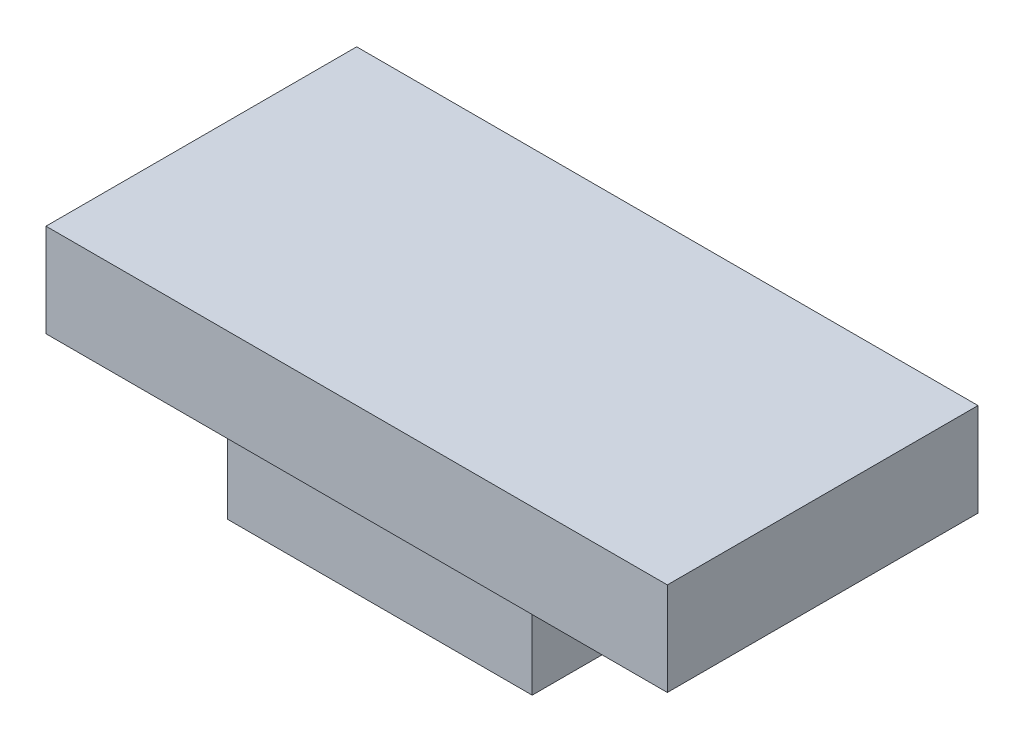
ISO-10303-21;
HEADER;
FILE_DESCRIPTION(('STEP AP214'),'2;1');
FILE_NAME('part.step','',(''),(''),'','','');
FILE_SCHEMA(('AUTOMOTIVE_DESIGN { 1 0 10303 214 1 1 1 1 }'));
ENDSEC;
DATA;
#1=APPLICATION_CONTEXT('core data for automotive mechanical design processes');
#2=APPLICATION_PROTOCOL_DEFINITION('international standard','automotive_design',2000,#1);
#3=PRODUCT_CONTEXT('',#1,'mechanical');
#4=PRODUCT('Part','Part','',(#3));
#5=PRODUCT_RELATED_PRODUCT_CATEGORY('part','',(#4));
#6=PRODUCT_DEFINITION_FORMATION('','',#4);
#7=PRODUCT_DEFINITION_CONTEXT('part definition',#1,'design');
#8=PRODUCT_DEFINITION('design','',#6,#7);
#9=PRODUCT_DEFINITION_SHAPE('','',#8);
#10=(LENGTH_UNIT() NAMED_UNIT(*) SI_UNIT(.MILLI.,.METRE.));
#11=(NAMED_UNIT(*) PLANE_ANGLE_UNIT() SI_UNIT($,.RADIAN.));
#12=(NAMED_UNIT(*) SI_UNIT($,.STERADIAN.) SOLID_ANGLE_UNIT());
#13=UNCERTAINTY_MEASURE_WITH_UNIT(LENGTH_MEASURE(1.E-05),#10,'distance_accuracy_value','');
#14=(GEOMETRIC_REPRESENTATION_CONTEXT(3) GLOBAL_UNCERTAINTY_ASSIGNED_CONTEXT((#13)) GLOBAL_UNIT_ASSIGNED_CONTEXT((#10,
#11,#12)) REPRESENTATION_CONTEXT('',''));
#15=CARTESIAN_POINT('',(0.,0.,0.));
#16=DIRECTION('',(0.,0.,1.));
#17=DIRECTION('',(1.,0.,0.));
#18=AXIS2_PLACEMENT_3D('',#15,#16,#17);
#19=CARTESIAN_POINT('',(0.,0.,0.));
#20=DIRECTION('',(0.,-1.,0.));
#21=DIRECTION('',(0.,0.,-1.));
#22=AXIS2_PLACEMENT_3D('',#19,#20,#21);
#23=PLANE('',#22);
#24=DIRECTION('',(0.,0.,-1.));
#25=VECTOR('',#24,1.);
#26=CARTESIAN_POINT('',(10.,0.,5.));
#27=LINE('',#26,#25);
#28=CARTESIAN_POINT('',(10.,0.,5.));
#29=VERTEX_POINT('',#28);
#30=CARTESIAN_POINT('',(10.,0.,-5.));
#31=VERTEX_POINT('',#30);
#32=EDGE_CURVE('E224',#29,#31,#27,.T.);
#33=ORIENTED_EDGE('',*,*,#32,.F.);
#34=DIRECTION('',(1.,0.,0.));
#35=VECTOR('',#34,1.);
#36=CARTESIAN_POINT('',(-10.,0.,5.));
#37=LINE('',#36,#35);
#38=CARTESIAN_POINT('',(-10.,0.,5.));
#39=VERTEX_POINT('',#38);
#40=EDGE_CURVE('E230',#39,#29,#37,.T.);
#41=ORIENTED_EDGE('',*,*,#40,.F.);
#42=DIRECTION('',(0.,0.,1.));
#43=VECTOR('',#42,1.);
#44=CARTESIAN_POINT('',(-10.,0.,5.));
#45=LINE('',#44,#43);
#46=CARTESIAN_POINT('',(-10.,0.,-5.));
#47=VERTEX_POINT('',#46);
#48=EDGE_CURVE('E246',#47,#39,#45,.T.);
#49=ORIENTED_EDGE('',*,*,#48,.F.);
#50=DIRECTION('',(-1.,0.,0.));
#51=VECTOR('',#50,1.);
#52=CARTESIAN_POINT('',(-10.,0.,-5.));
#53=LINE('',#52,#51);
#54=EDGE_CURVE('E243',#31,#47,#53,.T.);
#55=ORIENTED_EDGE('',*,*,#54,.F.);
#56=EDGE_LOOP('',(#33,#41,#49,#55));
#57=FACE_BOUND('',#56,.T.);
#58=DIRECTION('',(-1.,0.,0.));
#59=VECTOR('',#58,1.);
#60=CARTESIAN_POINT('',(-4.9,0.,4.25));
#61=LINE('',#60,#59);
#62=CARTESIAN_POINT('',(4.9,0.,4.25));
#63=VERTEX_POINT('',#62);
#64=CARTESIAN_POINT('',(-4.9,0.,4.25));
#65=VERTEX_POINT('',#64);
#66=EDGE_CURVE('E204',#63,#65,#61,.T.);
#67=ORIENTED_EDGE('',*,*,#66,.F.);
#68=DIRECTION('',(0.,0.,1.));
#69=VECTOR('',#68,1.);
#70=CARTESIAN_POINT('',(4.9,0.,-4.25));
#71=LINE('',#70,#69);
#72=CARTESIAN_POINT('',(4.9,0.,-4.25));
#73=VERTEX_POINT('',#72);
#74=EDGE_CURVE('E154',#73,#63,#71,.T.);
#75=ORIENTED_EDGE('',*,*,#74,.F.);
#76=DIRECTION('',(1.,0.,0.));
#77=VECTOR('',#76,1.);
#78=CARTESIAN_POINT('',(-4.9,0.,-4.25));
#79=LINE('',#78,#77);
#80=CARTESIAN_POINT('',(-4.9,0.,-4.25));
#81=VERTEX_POINT('',#80);
#82=EDGE_CURVE('E191',#81,#73,#79,.T.);
#83=ORIENTED_EDGE('',*,*,#82,.F.);
#84=DIRECTION('',(0.,0.,-1.));
#85=VECTOR('',#84,1.);
#86=CARTESIAN_POINT('',(-4.9,0.,-4.25));
#87=LINE('',#86,#85);
#88=EDGE_CURVE('E207',#65,#81,#87,.T.);
#89=ORIENTED_EDGE('',*,*,#88,.F.);
#90=EDGE_LOOP('',(#67,#75,#83,#89));
#91=FACE_BOUND('',#90,.T.);
#92=ADVANCED_FACE('F43',(#57,#91),#23,.T.);
#93=CARTESIAN_POINT('',(10.,3.,5.));
#94=DIRECTION('',(-1.,0.,0.));
#95=DIRECTION('',(0.,0.,1.));
#96=AXIS2_PLACEMENT_3D('',#93,#94,#95);
#97=PLANE('',#96);
#98=ORIENTED_EDGE('',*,*,#32,.T.);
#99=DIRECTION('',(0.,-1.,0.));
#100=VECTOR('',#99,1.);
#101=CARTESIAN_POINT('',(10.,3.,-5.));
#102=LINE('',#101,#100);
#103=CARTESIAN_POINT('',(10.,3.,-5.));
#104=VERTEX_POINT('',#103);
#105=EDGE_CURVE('E11',#104,#31,#102,.T.);
#106=ORIENTED_EDGE('',*,*,#105,.F.);
#107=DIRECTION('',(0.,0.,-1.));
#108=VECTOR('',#107,1.);
#109=CARTESIAN_POINT('',(10.,3.,5.));
#110=LINE('',#109,#108);
#111=CARTESIAN_POINT('',(10.,3.,5.));
#112=VERTEX_POINT('',#111);
#113=EDGE_CURVE('E225',#112,#104,#110,.T.);
#114=ORIENTED_EDGE('',*,*,#113,.F.);
#115=DIRECTION('',(0.,-1.,0.));
#116=VECTOR('',#115,1.);
#117=CARTESIAN_POINT('',(10.,3.,5.));
#118=LINE('',#117,#116);
#119=EDGE_CURVE('E239',#112,#29,#118,.T.);
#120=ORIENTED_EDGE('',*,*,#119,.T.);
#121=EDGE_LOOP('',(#98,#106,#114,#120));
#122=FACE_BOUND('',#121,.T.);
#123=ADVANCED_FACE('F45',(#122),#97,.F.);
#124=CARTESIAN_POINT('',(-10.,3.,-5.));
#125=DIRECTION('',(0.,0.,1.));
#126=DIRECTION('',(1.,0.,0.));
#127=AXIS2_PLACEMENT_3D('',#124,#125,#126);
#128=PLANE('',#127);
#129=ORIENTED_EDGE('',*,*,#54,.T.);
#130=DIRECTION('',(0.,-1.,0.));
#131=VECTOR('',#130,1.);
#132=CARTESIAN_POINT('',(-10.,3.,-5.));
#133=LINE('',#132,#131);
#134=CARTESIAN_POINT('',(-10.,3.,-5.));
#135=VERTEX_POINT('',#134);
#136=EDGE_CURVE('E52',#135,#47,#133,.T.);
#137=ORIENTED_EDGE('',*,*,#136,.F.);
#138=DIRECTION('',(-1.,0.,0.));
#139=VECTOR('',#138,1.);
#140=CARTESIAN_POINT('',(-10.,3.,-5.));
#141=LINE('',#140,#139);
#142=EDGE_CURVE('E229',#104,#135,#141,.T.);
#143=ORIENTED_EDGE('',*,*,#142,.F.);
#144=ORIENTED_EDGE('',*,*,#105,.T.);
#145=EDGE_LOOP('',(#129,#137,#143,#144));
#146=FACE_BOUND('',#145,.T.);
#147=ADVANCED_FACE('F279',(#146),#128,.F.);
#148=CARTESIAN_POINT('',(-10.,3.,5.));
#149=DIRECTION('',(1.,0.,0.));
#150=DIRECTION('',(0.,0.,-1.));
#151=AXIS2_PLACEMENT_3D('',#148,#149,#150);
#152=PLANE('',#151);
#153=ORIENTED_EDGE('',*,*,#48,.T.);
#154=DIRECTION('',(0.,-1.,0.));
#155=VECTOR('',#154,1.);
#156=CARTESIAN_POINT('',(-10.,3.,5.));
#157=LINE('',#156,#155);
#158=CARTESIAN_POINT('',(-10.,3.,5.));
#159=VERTEX_POINT('',#158);
#160=EDGE_CURVE('E254',#159,#39,#157,.T.);
#161=ORIENTED_EDGE('',*,*,#160,.F.);
#162=DIRECTION('',(0.,0.,1.));
#163=VECTOR('',#162,1.);
#164=CARTESIAN_POINT('',(-10.,3.,5.));
#165=LINE('',#164,#163);
#166=EDGE_CURVE('E233',#135,#159,#165,.T.);
#167=ORIENTED_EDGE('',*,*,#166,.F.);
#168=ORIENTED_EDGE('',*,*,#136,.T.);
#169=EDGE_LOOP('',(#153,#161,#167,#168));
#170=FACE_BOUND('',#169,.T.);
#171=ADVANCED_FACE('F263',(#170),#152,.F.);
#172=CARTESIAN_POINT('',(-10.,3.,5.));
#173=DIRECTION('',(0.,0.,-1.));
#174=DIRECTION('',(-1.,0.,0.));
#175=AXIS2_PLACEMENT_3D('',#172,#173,#174);
#176=PLANE('',#175);
#177=ORIENTED_EDGE('',*,*,#40,.T.);
#178=ORIENTED_EDGE('',*,*,#119,.F.);
#179=DIRECTION('',(1.,0.,0.));
#180=VECTOR('',#179,1.);
#181=CARTESIAN_POINT('',(-10.,3.,5.));
#182=LINE('',#181,#180);
#183=EDGE_CURVE('E236',#159,#112,#182,.T.);
#184=ORIENTED_EDGE('',*,*,#183,.F.);
#185=ORIENTED_EDGE('',*,*,#160,.T.);
#186=EDGE_LOOP('',(#177,#178,#184,#185));
#187=FACE_BOUND('',#186,.T.);
#188=ADVANCED_FACE('F272',(#187),#176,.F.);
#189=CARTESIAN_POINT('',(0.,3.,0.));
#190=DIRECTION('',(0.,-1.,0.));
#191=DIRECTION('',(0.,0.,-1.));
#192=AXIS2_PLACEMENT_3D('',#189,#190,#191);
#193=PLANE('',#192);
#194=ORIENTED_EDGE('',*,*,#113,.T.);
#195=ORIENTED_EDGE('',*,*,#142,.T.);
#196=ORIENTED_EDGE('',*,*,#166,.T.);
#197=ORIENTED_EDGE('',*,*,#183,.T.);
#198=EDGE_LOOP('',(#194,#195,#196,#197));
#199=FACE_BOUND('',#198,.T.);
#200=ADVANCED_FACE('F278',(#199),#193,.F.);
#201=CARTESIAN_POINT('',(0.,-3.,0.));
#202=DIRECTION('',(0.,1.,0.));
#203=DIRECTION('',(0.,0.,1.));
#204=AXIS2_PLACEMENT_3D('',#201,#202,#203);
#205=PLANE('',#204);
#206=DIRECTION('',(0.,0.,1.));
#207=VECTOR('',#206,1.);
#208=CARTESIAN_POINT('',(4.9,-3.,-4.25));
#209=LINE('',#208,#207);
#210=CARTESIAN_POINT('',(4.9,-3.,-4.25));
#211=VERTEX_POINT('',#210);
#212=CARTESIAN_POINT('',(4.9,-3.,4.25));
#213=VERTEX_POINT('',#212);
#214=EDGE_CURVE('E186',#211,#213,#209,.T.);
#215=ORIENTED_EDGE('',*,*,#214,.T.);
#216=DIRECTION('',(-1.,0.,0.));
#217=VECTOR('',#216,1.);
#218=CARTESIAN_POINT('',(-4.9,-3.,4.25));
#219=LINE('',#218,#217);
#220=CARTESIAN_POINT('',(-4.9,-3.,4.25));
#221=VERTEX_POINT('',#220);
#222=EDGE_CURVE('E190',#213,#221,#219,.T.);
#223=ORIENTED_EDGE('',*,*,#222,.T.);
#224=DIRECTION('',(0.,0.,-1.));
#225=VECTOR('',#224,1.);
#226=CARTESIAN_POINT('',(-4.9,-3.,-4.25));
#227=LINE('',#226,#225);
#228=CARTESIAN_POINT('',(-4.9,-3.,-4.25));
#229=VERTEX_POINT('',#228);
#230=EDGE_CURVE('E194',#221,#229,#227,.T.);
#231=ORIENTED_EDGE('',*,*,#230,.T.);
#232=DIRECTION('',(1.,0.,0.));
#233=VECTOR('',#232,1.);
#234=CARTESIAN_POINT('',(-4.9,-3.,-4.25));
#235=LINE('',#234,#233);
#236=EDGE_CURVE('E197',#229,#211,#235,.T.);
#237=ORIENTED_EDGE('',*,*,#236,.T.);
#238=EDGE_LOOP('',(#215,#223,#231,#237));
#239=FACE_BOUND('',#238,.T.);
#240=DIRECTION('',(0.,0.,1.));
#241=VECTOR('',#240,1.);
#242=CARTESIAN_POINT('',(2.9,-3.,-2.25));
#243=LINE('',#242,#241);
#244=CARTESIAN_POINT('',(2.9,-3.,-2.25));
#245=VERTEX_POINT('',#244);
#246=CARTESIAN_POINT('',(2.9,-3.,2.25));
#247=VERTEX_POINT('',#246);
#248=EDGE_CURVE('E135',#245,#247,#243,.T.);
#249=ORIENTED_EDGE('',*,*,#248,.F.);
#250=DIRECTION('',(1.,0.,0.));
#251=VECTOR('',#250,1.);
#252=CARTESIAN_POINT('',(-2.9,-3.,-2.25));
#253=LINE('',#252,#251);
#254=CARTESIAN_POINT('',(-2.9,-3.,-2.25));
#255=VERTEX_POINT('',#254);
#256=EDGE_CURVE('E164',#255,#245,#253,.T.);
#257=ORIENTED_EDGE('',*,*,#256,.F.);
#258=DIRECTION('',(0.,0.,-1.));
#259=VECTOR('',#258,1.);
#260=CARTESIAN_POINT('',(-2.9,-3.,-2.25));
#261=LINE('',#260,#259);
#262=CARTESIAN_POINT('',(-2.9,-3.,2.25));
#263=VERTEX_POINT('',#262);
#264=EDGE_CURVE('E160',#263,#255,#261,.T.);
#265=ORIENTED_EDGE('',*,*,#264,.F.);
#266=DIRECTION('',(-1.,0.,0.));
#267=VECTOR('',#266,1.);
#268=CARTESIAN_POINT('',(-2.9,-3.,2.25));
#269=LINE('',#268,#267);
#270=EDGE_CURVE('E145',#247,#263,#269,.T.);
#271=ORIENTED_EDGE('',*,*,#270,.F.);
#272=EDGE_LOOP('',(#249,#257,#265,#271));
#273=FACE_BOUND('',#272,.T.);
#274=ADVANCED_FACE('F158',(#239,#273),#205,.F.);
#275=CARTESIAN_POINT('',(4.9,-3.,-4.25));
#276=DIRECTION('',(-1.,0.,0.));
#277=DIRECTION('',(0.,0.,1.));
#278=AXIS2_PLACEMENT_3D('',#275,#276,#277);
#279=PLANE('',#278);
#280=ORIENTED_EDGE('',*,*,#74,.T.);
#281=DIRECTION('',(0.,1.,0.));
#282=VECTOR('',#281,1.);
#283=CARTESIAN_POINT('',(4.9,-3.,4.25));
#284=LINE('',#283,#282);
#285=EDGE_CURVE('E221',#213,#63,#284,.T.);
#286=ORIENTED_EDGE('',*,*,#285,.F.);
#287=ORIENTED_EDGE('',*,*,#214,.F.);
#288=DIRECTION('',(0.,1.,0.));
#289=VECTOR('',#288,1.);
#290=CARTESIAN_POINT('',(4.9,-3.,-4.25));
#291=LINE('',#290,#289);
#292=EDGE_CURVE('E200',#211,#73,#291,.T.);
#293=ORIENTED_EDGE('',*,*,#292,.T.);
#294=EDGE_LOOP('',(#280,#286,#287,#293));
#295=FACE_BOUND('',#294,.T.);
#296=ADVANCED_FACE('F315',(#295),#279,.F.);
#297=CARTESIAN_POINT('',(-4.9,-3.,4.25));
#298=DIRECTION('',(0.,0.,-1.));
#299=DIRECTION('',(-1.,0.,0.));
#300=AXIS2_PLACEMENT_3D('',#297,#298,#299);
#301=PLANE('',#300);
#302=ORIENTED_EDGE('',*,*,#66,.T.);
#303=DIRECTION('',(0.,1.,0.));
#304=VECTOR('',#303,1.);
#305=CARTESIAN_POINT('',(-4.9,-3.,4.25));
#306=LINE('',#305,#304);
#307=EDGE_CURVE('E217',#221,#65,#306,.T.);
#308=ORIENTED_EDGE('',*,*,#307,.F.);
#309=ORIENTED_EDGE('',*,*,#222,.F.);
#310=ORIENTED_EDGE('',*,*,#285,.T.);
#311=EDGE_LOOP('',(#302,#308,#309,#310));
#312=FACE_BOUND('',#311,.T.);
#313=ADVANCED_FACE('F322',(#312),#301,.F.);
#314=CARTESIAN_POINT('',(-4.9,-3.,-4.25));
#315=DIRECTION('',(1.,0.,0.));
#316=DIRECTION('',(0.,0.,-1.));
#317=AXIS2_PLACEMENT_3D('',#314,#315,#316);
#318=PLANE('',#317);
#319=ORIENTED_EDGE('',*,*,#88,.T.);
#320=DIRECTION('',(0.,1.,0.));
#321=VECTOR('',#320,1.);
#322=CARTESIAN_POINT('',(-4.9,-3.,-4.25));
#323=LINE('',#322,#321);
#324=EDGE_CURVE('E59',#229,#81,#323,.T.);
#325=ORIENTED_EDGE('',*,*,#324,.F.);
#326=ORIENTED_EDGE('',*,*,#230,.F.);
#327=ORIENTED_EDGE('',*,*,#307,.T.);
#328=EDGE_LOOP('',(#319,#325,#326,#327));
#329=FACE_BOUND('',#328,.T.);
#330=ADVANCED_FACE('F319',(#329),#318,.F.);
#331=CARTESIAN_POINT('',(-4.9,-3.,-4.25));
#332=DIRECTION('',(0.,0.,1.));
#333=DIRECTION('',(1.,0.,0.));
#334=AXIS2_PLACEMENT_3D('',#331,#332,#333);
#335=PLANE('',#334);
#336=ORIENTED_EDGE('',*,*,#82,.T.);
#337=ORIENTED_EDGE('',*,*,#292,.F.);
#338=ORIENTED_EDGE('',*,*,#236,.F.);
#339=ORIENTED_EDGE('',*,*,#324,.T.);
#340=EDGE_LOOP('',(#336,#337,#338,#339));
#341=FACE_BOUND('',#340,.T.);
#342=ADVANCED_FACE('F312',(#341),#335,.F.);
#343=CARTESIAN_POINT('',(2.9,-3.,-2.25));
#344=DIRECTION('',(-1.,0.,0.));
#345=DIRECTION('',(0.,0.,1.));
#346=AXIS2_PLACEMENT_3D('',#343,#344,#345);
#347=PLANE('',#346);
#348=DIRECTION('',(0.,0.,1.));
#349=VECTOR('',#348,1.);
#350=CARTESIAN_POINT('',(2.9,0.,-2.25));
#351=LINE('',#350,#349);
#352=CARTESIAN_POINT('',(2.9,0.,-2.25));
#353=VERTEX_POINT('',#352);
#354=CARTESIAN_POINT('',(2.9,0.,2.25));
#355=VERTEX_POINT('',#354);
#356=EDGE_CURVE('E67',#353,#355,#351,.T.);
#357=ORIENTED_EDGE('',*,*,#356,.F.);
#358=DIRECTION('',(0.,1.,0.));
#359=VECTOR('',#358,1.);
#360=CARTESIAN_POINT('',(2.9,-3.,-2.25));
#361=LINE('',#360,#359);
#362=EDGE_CURVE('E140',#245,#353,#361,.T.);
#363=ORIENTED_EDGE('',*,*,#362,.F.);
#364=ORIENTED_EDGE('',*,*,#248,.T.);
#365=DIRECTION('',(0.,1.,0.));
#366=VECTOR('',#365,1.);
#367=CARTESIAN_POINT('',(2.9,-3.,2.25));
#368=LINE('',#367,#366);
#369=EDGE_CURVE('E138',#247,#355,#368,.T.);
#370=ORIENTED_EDGE('',*,*,#369,.T.);
#371=EDGE_LOOP('',(#357,#363,#364,#370));
#372=FACE_BOUND('',#371,.T.);
#373=ADVANCED_FACE('F137',(#372),#347,.T.);
#374=CARTESIAN_POINT('',(-2.9,-3.,2.25));
#375=DIRECTION('',(0.,0.,-1.));
#376=DIRECTION('',(-1.,0.,0.));
#377=AXIS2_PLACEMENT_3D('',#374,#375,#376);
#378=PLANE('',#377);
#379=DIRECTION('',(-1.,0.,0.));
#380=VECTOR('',#379,1.);
#381=CARTESIAN_POINT('',(-2.9,0.,2.25));
#382=LINE('',#381,#380);
#383=CARTESIAN_POINT('',(-2.9,0.,2.25));
#384=VERTEX_POINT('',#383);
#385=EDGE_CURVE('E152',#355,#384,#382,.T.);
#386=ORIENTED_EDGE('',*,*,#385,.F.);
#387=ORIENTED_EDGE('',*,*,#369,.F.);
#388=ORIENTED_EDGE('',*,*,#270,.T.);
#389=DIRECTION('',(0.,1.,0.));
#390=VECTOR('',#389,1.);
#391=CARTESIAN_POINT('',(-2.9,-3.,2.25));
#392=LINE('',#391,#390);
#393=EDGE_CURVE('E155',#263,#384,#392,.T.);
#394=ORIENTED_EDGE('',*,*,#393,.T.);
#395=EDGE_LOOP('',(#386,#387,#388,#394));
#396=FACE_BOUND('',#395,.T.);
#397=ADVANCED_FACE('F149',(#396),#378,.T.);
#398=CARTESIAN_POINT('',(-2.9,-3.,-2.25));
#399=DIRECTION('',(1.,0.,0.));
#400=DIRECTION('',(0.,0.,-1.));
#401=AXIS2_PLACEMENT_3D('',#398,#399,#400);
#402=PLANE('',#401);
#403=DIRECTION('',(0.,0.,-1.));
#404=VECTOR('',#403,1.);
#405=CARTESIAN_POINT('',(-2.9,0.,-2.25));
#406=LINE('',#405,#404);
#407=CARTESIAN_POINT('',(-2.9,0.,-2.25));
#408=VERTEX_POINT('',#407);
#409=EDGE_CURVE('E173',#384,#408,#406,.T.);
#410=ORIENTED_EDGE('',*,*,#409,.F.);
#411=ORIENTED_EDGE('',*,*,#393,.F.);
#412=ORIENTED_EDGE('',*,*,#264,.T.);
#413=DIRECTION('',(0.,1.,0.));
#414=VECTOR('',#413,1.);
#415=CARTESIAN_POINT('',(-2.9,-3.,-2.25));
#416=LINE('',#415,#414);
#417=EDGE_CURVE('E180',#255,#408,#416,.T.);
#418=ORIENTED_EDGE('',*,*,#417,.T.);
#419=EDGE_LOOP('',(#410,#411,#412,#418));
#420=FACE_BOUND('',#419,.T.);
#421=ADVANCED_FACE('F298',(#420),#402,.T.);
#422=CARTESIAN_POINT('',(-2.9,-3.,-2.25));
#423=DIRECTION('',(0.,0.,1.));
#424=DIRECTION('',(1.,0.,0.));
#425=AXIS2_PLACEMENT_3D('',#422,#423,#424);
#426=PLANE('',#425);
#427=DIRECTION('',(1.,0.,0.));
#428=VECTOR('',#427,1.);
#429=CARTESIAN_POINT('',(-2.9,0.,-2.25));
#430=LINE('',#429,#428);
#431=EDGE_CURVE('E146',#408,#353,#430,.T.);
#432=ORIENTED_EDGE('',*,*,#431,.F.);
#433=ORIENTED_EDGE('',*,*,#417,.F.);
#434=ORIENTED_EDGE('',*,*,#256,.T.);
#435=ORIENTED_EDGE('',*,*,#362,.T.);
#436=EDGE_LOOP('',(#432,#433,#434,#435));
#437=FACE_BOUND('',#436,.T.);
#438=ADVANCED_FACE('F294',(#437),#426,.T.);
#439=ORIENTED_EDGE('',*,*,#356,.T.);
#440=ORIENTED_EDGE('',*,*,#385,.T.);
#441=ORIENTED_EDGE('',*,*,#409,.T.);
#442=ORIENTED_EDGE('',*,*,#431,.T.);
#443=EDGE_LOOP('',(#439,#440,#441,#442));
#444=FACE_BOUND('',#443,.T.);
#445=ADVANCED_FACE('F288',(#444),#23,.T.);
#446=CLOSED_SHELL('',(#92,#123,#147,#171,#188,#200,#274,#296,#313,#330,#342,#373,#397,#421,#438,#445));
#447=MANIFOLD_SOLID_BREP('B2',#446);
#448=ADVANCED_BREP_SHAPE_REPRESENTATION('',(#18,#447),#14);
#449=SHAPE_DEFINITION_REPRESENTATION(#9,#448);
ENDSEC;
END-ISO-10303-21;
